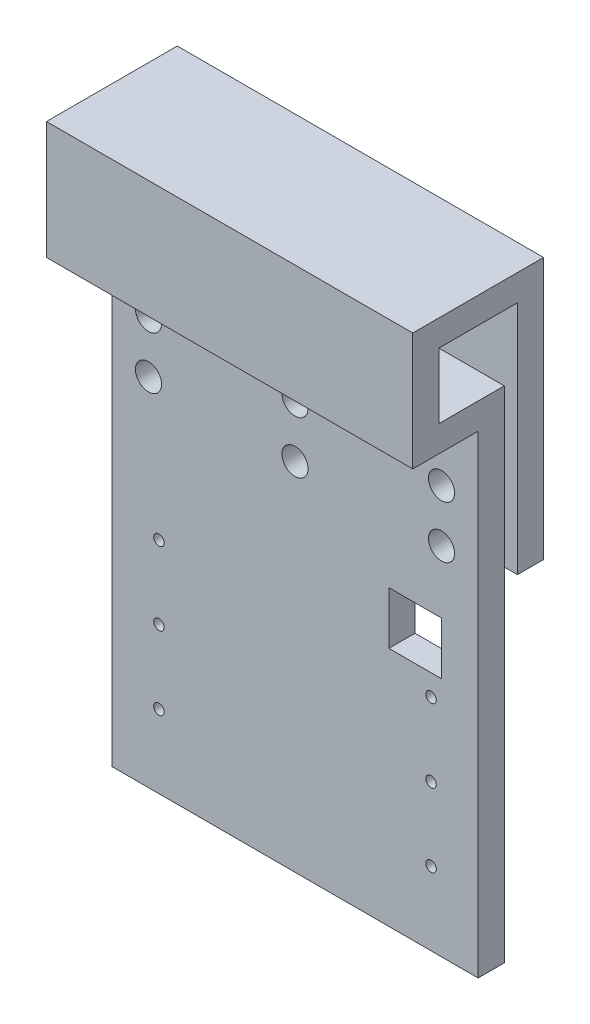
ISO-10303-21;
HEADER;
FILE_DESCRIPTION(('STEP AP214'),'2;1');
FILE_NAME('part.step','',(''),(''),'','','');
FILE_SCHEMA(('AUTOMOTIVE_DESIGN { 1 0 10303 214 1 1 1 1 }'));
ENDSEC;
DATA;
#1=APPLICATION_CONTEXT('core data for automotive mechanical design processes');
#2=APPLICATION_PROTOCOL_DEFINITION('international standard','automotive_design',2000,#1);
#3=PRODUCT_CONTEXT('',#1,'mechanical');
#4=PRODUCT('Part','Part','',(#3));
#5=PRODUCT_RELATED_PRODUCT_CATEGORY('part','',(#4));
#6=PRODUCT_DEFINITION_FORMATION('','',#4);
#7=PRODUCT_DEFINITION_CONTEXT('part definition',#1,'design');
#8=PRODUCT_DEFINITION('design','',#6,#7);
#9=PRODUCT_DEFINITION_SHAPE('','',#8);
#10=(LENGTH_UNIT() NAMED_UNIT(*) SI_UNIT(.MILLI.,.METRE.));
#11=(NAMED_UNIT(*) PLANE_ANGLE_UNIT() SI_UNIT($,.RADIAN.));
#12=(NAMED_UNIT(*) SI_UNIT($,.STERADIAN.) SOLID_ANGLE_UNIT());
#13=UNCERTAINTY_MEASURE_WITH_UNIT(LENGTH_MEASURE(1.E-05),#10,'distance_accuracy_value','');
#14=(GEOMETRIC_REPRESENTATION_CONTEXT(3) GLOBAL_UNCERTAINTY_ASSIGNED_CONTEXT((#13)) GLOBAL_UNIT_ASSIGNED_CONTEXT((#10,
#11,#12)) REPRESENTATION_CONTEXT('',''));
#15=CARTESIAN_POINT('',(0.,0.,0.));
#16=DIRECTION('',(0.,0.,1.));
#17=DIRECTION('',(1.,0.,0.));
#18=AXIS2_PLACEMENT_3D('',#15,#16,#17);
#19=CARTESIAN_POINT('',(88.9,0.,-6.35000000000001));
#20=DIRECTION('',(0.,0.,-1.));
#21=DIRECTION('',(0.,1.,0.));
#22=AXIS2_PLACEMENT_3D('',#19,#20,#21);
#23=PLANE('',#22);
#24=CARTESIAN_POINT('',(11.43,-36.195,-6.35000000000001));
#25=DIRECTION('',(0.,0.,-1.));
#26=DIRECTION('',(0.,1.,0.));
#27=AXIS2_PLACEMENT_3D('',#24,#25,#26);
#28=CIRCLE('',#27,1.26999999999999);
#29=CARTESIAN_POINT('',(11.43,-34.925,-6.35000000000001));
#30=VERTEX_POINT('',#29);
#31=EDGE_CURVE('E232',#30,#30,#28,.F.);
#32=ORIENTED_EDGE('',*,*,#31,.T.);
#33=EDGE_LOOP('',(#32));
#34=FACE_BOUND('',#33,.T.);
#35=DIRECTION('',(0.,-1.,0.));
#36=VECTOR('',#35,1.);
#37=CARTESIAN_POINT('',(0.,0.,-6.35000000000001));
#38=LINE('',#37,#36);
#39=CARTESIAN_POINT('',(0.,49.53,-6.35));
#40=VERTEX_POINT('',#39);
#41=CARTESIAN_POINT('',(0.,-71.755,-6.35000000000002));
#42=VERTEX_POINT('',#41);
#43=EDGE_CURVE('E250',#40,#42,#38,.T.);
#44=ORIENTED_EDGE('',*,*,#43,.F.);
#45=DIRECTION('',(-1.,0.,0.));
#46=VECTOR('',#45,1.);
#47=CARTESIAN_POINT('',(88.9,49.53,-6.35));
#48=LINE('',#47,#46);
#49=CARTESIAN_POINT('',(88.9,49.53,-6.35));
#50=VERTEX_POINT('',#49);
#51=EDGE_CURVE('E157',#50,#40,#48,.T.);
#52=ORIENTED_EDGE('',*,*,#51,.F.);
#53=DIRECTION('',(0.,-1.,0.));
#54=VECTOR('',#53,1.);
#55=CARTESIAN_POINT('',(88.9,0.,-6.35000000000001));
#56=LINE('',#55,#54);
#57=CARTESIAN_POINT('',(88.9,-71.755,-6.35000000000002));
#58=VERTEX_POINT('',#57);
#59=EDGE_CURVE('E251',#50,#58,#56,.T.);
#60=ORIENTED_EDGE('',*,*,#59,.T.);
#61=DIRECTION('',(-1.,0.,0.));
#62=VECTOR('',#61,1.);
#63=CARTESIAN_POINT('',(88.9,-71.755,-6.35000000000002));
#64=LINE('',#63,#62);
#65=EDGE_CURVE('E293',#58,#42,#64,.T.);
#66=ORIENTED_EDGE('',*,*,#65,.T.);
#67=EDGE_LOOP('',(#44,#52,#60,#66));
#68=FACE_BOUND('',#67,.T.);
#69=CARTESIAN_POINT('',(80.01,27.305,-6.35000000000001));
#70=DIRECTION('',(0.,0.,-1.));
#71=DIRECTION('',(0.,1.,0.));
#72=AXIS2_PLACEMENT_3D('',#69,#70,#71);
#73=CIRCLE('',#72,3.175);
#74=CARTESIAN_POINT('',(80.01,30.48,-6.35000000000001));
#75=VERTEX_POINT('',#74);
#76=EDGE_CURVE('E383',#75,#75,#73,.T.);
#77=ORIENTED_EDGE('',*,*,#76,.F.);
#78=EDGE_LOOP('',(#77));
#79=FACE_BOUND('',#78,.T.);
#80=DIRECTION('',(-1.,0.,0.));
#81=VECTOR('',#80,1.);
#82=CARTESIAN_POINT('',(88.9,-13.3029247066067,-6.35000000000001));
#83=LINE('',#82,#81);
#84=CARTESIAN_POINT('',(80.01,-13.3029247066067,-6.35000000000001));
#85=VERTEX_POINT('',#84);
#86=CARTESIAN_POINT('',(67.2257445853371,-13.3029247066067,-6.35000000000001));
#87=VERTEX_POINT('',#86);
#88=EDGE_CURVE('E164',#85,#87,#83,.T.);
#89=ORIENTED_EDGE('',*,*,#88,.F.);
#90=DIRECTION('',(0.,-1.,0.));
#91=VECTOR('',#90,1.);
#92=CARTESIAN_POINT('',(80.01,0.,-6.35000000000001));
#93=LINE('',#92,#91);
#94=CARTESIAN_POINT('',(80.01,-0.542664975393077,-6.35000000000001));
#95=VERTEX_POINT('',#94);
#96=EDGE_CURVE('E408',#95,#85,#93,.T.);
#97=ORIENTED_EDGE('',*,*,#96,.F.);
#98=DIRECTION('',(-1.,0.,0.));
#99=VECTOR('',#98,1.);
#100=CARTESIAN_POINT('',(88.9,-0.542664975393077,-6.35000000000001));
#101=LINE('',#100,#99);
#102=CARTESIAN_POINT('',(67.2257445853371,-0.542664975393077,-6.35000000000001));
#103=VERTEX_POINT('',#102);
#104=EDGE_CURVE('E404',#95,#103,#101,.T.);
#105=ORIENTED_EDGE('',*,*,#104,.T.);
#106=DIRECTION('',(0.,-1.,0.));
#107=VECTOR('',#106,1.);
#108=CARTESIAN_POINT('',(67.2257445853371,0.,-6.35000000000001));
#109=LINE('',#108,#107);
#110=EDGE_CURVE('E401',#103,#87,#109,.T.);
#111=ORIENTED_EDGE('',*,*,#110,.T.);
#112=EDGE_LOOP('',(#89,#97,#105,#111));
#113=FACE_BOUND('',#112,.T.);
#114=CARTESIAN_POINT('',(77.47,-18.415,-6.35000000000001));
#115=DIRECTION('',(0.,0.,-1.));
#116=DIRECTION('',(0.,1.,0.));
#117=AXIS2_PLACEMENT_3D('',#114,#115,#116);
#118=CIRCLE('',#117,1.26999999999999);
#119=CARTESIAN_POINT('',(77.47,-17.145,-6.35000000000001));
#120=VERTEX_POINT('',#119);
#121=EDGE_CURVE('E184',#120,#120,#118,.T.);
#122=ORIENTED_EDGE('',*,*,#121,.F.);
#123=EDGE_LOOP('',(#122));
#124=FACE_BOUND('',#123,.T.);
#125=CARTESIAN_POINT('',(77.47,-36.195,-6.35000000000001));
#126=DIRECTION('',(0.,0.,-1.));
#127=DIRECTION('',(0.,1.,0.));
#128=AXIS2_PLACEMENT_3D('',#125,#126,#127);
#129=CIRCLE('',#128,1.26999999999999);
#130=CARTESIAN_POINT('',(77.47,-34.925,-6.35000000000001));
#131=VERTEX_POINT('',#130);
#132=EDGE_CURVE('E189',#131,#131,#129,.T.);
#133=ORIENTED_EDGE('',*,*,#132,.F.);
#134=EDGE_LOOP('',(#133));
#135=FACE_BOUND('',#134,.T.);
#136=CARTESIAN_POINT('',(77.47,-53.975,-6.35000000000001));
#137=DIRECTION('',(0.,0.,-1.));
#138=DIRECTION('',(0.,1.,0.));
#139=AXIS2_PLACEMENT_3D('',#136,#137,#138);
#140=CIRCLE('',#139,1.26999999999999);
#141=CARTESIAN_POINT('',(77.47,-52.705,-6.35000000000001));
#142=VERTEX_POINT('',#141);
#143=EDGE_CURVE('E194',#142,#142,#140,.T.);
#144=ORIENTED_EDGE('',*,*,#143,.F.);
#145=EDGE_LOOP('',(#144));
#146=FACE_BOUND('',#145,.T.);
#147=CARTESIAN_POINT('',(44.45,27.305,-6.35000000000001));
#148=DIRECTION('',(0.,0.,-1.));
#149=DIRECTION('',(0.,1.,0.));
#150=AXIS2_PLACEMENT_3D('',#147,#148,#149);
#151=CIRCLE('',#150,3.175);
#152=CARTESIAN_POINT('',(44.45,30.48,-6.35000000000001));
#153=VERTEX_POINT('',#152);
#154=EDGE_CURVE('E205',#153,#153,#151,.T.);
#155=ORIENTED_EDGE('',*,*,#154,.F.);
#156=EDGE_LOOP('',(#155));
#157=FACE_BOUND('',#156,.T.);
#158=CARTESIAN_POINT('',(8.89,27.305,-6.35000000000001));
#159=DIRECTION('',(0.,0.,-1.));
#160=DIRECTION('',(0.,1.,0.));
#161=AXIS2_PLACEMENT_3D('',#158,#159,#160);
#162=CIRCLE('',#161,3.175);
#163=CARTESIAN_POINT('',(8.89,30.48,-6.35000000000001));
#164=VERTEX_POINT('',#163);
#165=EDGE_CURVE('E211',#164,#164,#162,.T.);
#166=ORIENTED_EDGE('',*,*,#165,.F.);
#167=EDGE_LOOP('',(#166));
#168=FACE_BOUND('',#167,.T.);
#169=CARTESIAN_POINT('',(8.89,14.605,-6.35000000000001));
#170=DIRECTION('',(0.,0.,-1.));
#171=DIRECTION('',(0.,1.,0.));
#172=AXIS2_PLACEMENT_3D('',#169,#170,#171);
#173=CIRCLE('',#172,3.175);
#174=CARTESIAN_POINT('',(8.89,17.78,-6.35000000000001));
#175=VERTEX_POINT('',#174);
#176=EDGE_CURVE('E217',#175,#175,#173,.T.);
#177=ORIENTED_EDGE('',*,*,#176,.F.);
#178=EDGE_LOOP('',(#177));
#179=FACE_BOUND('',#178,.T.);
#180=CARTESIAN_POINT('',(44.45,14.605,-6.35000000000001));
#181=DIRECTION('',(0.,0.,-1.));
#182=DIRECTION('',(0.,1.,0.));
#183=AXIS2_PLACEMENT_3D('',#180,#181,#182);
#184=CIRCLE('',#183,3.175);
#185=CARTESIAN_POINT('',(44.45,17.78,-6.35000000000001));
#186=VERTEX_POINT('',#185);
#187=EDGE_CURVE('E223',#186,#186,#184,.T.);
#188=ORIENTED_EDGE('',*,*,#187,.F.);
#189=EDGE_LOOP('',(#188));
#190=FACE_BOUND('',#189,.T.);
#191=CARTESIAN_POINT('',(80.01,14.605,-6.35000000000001));
#192=DIRECTION('',(0.,0.,-1.));
#193=DIRECTION('',(0.,1.,0.));
#194=AXIS2_PLACEMENT_3D('',#191,#192,#193);
#195=CIRCLE('',#194,3.175);
#196=CARTESIAN_POINT('',(80.01,17.78,-6.35000000000001));
#197=VERTEX_POINT('',#196);
#198=EDGE_CURVE('E228',#197,#197,#195,.T.);
#199=ORIENTED_EDGE('',*,*,#198,.F.);
#200=EDGE_LOOP('',(#199));
#201=FACE_BOUND('',#200,.T.);
#202=CARTESIAN_POINT('',(11.43,-18.415,-6.35000000000001));
#203=DIRECTION('',(0.,0.,-1.));
#204=DIRECTION('',(0.,1.,0.));
#205=AXIS2_PLACEMENT_3D('',#202,#203,#204);
#206=CIRCLE('',#205,1.26999999999999);
#207=CARTESIAN_POINT('',(11.43,-17.145,-6.35000000000001));
#208=VERTEX_POINT('',#207);
#209=EDGE_CURVE('E227',#208,#208,#206,.F.);
#210=ORIENTED_EDGE('',*,*,#209,.T.);
#211=EDGE_LOOP('',(#210));
#212=FACE_BOUND('',#211,.T.);
#213=CARTESIAN_POINT('',(11.43,-53.975,-6.35000000000001));
#214=DIRECTION('',(0.,0.,-1.));
#215=DIRECTION('',(0.,1.,0.));
#216=AXIS2_PLACEMENT_3D('',#213,#214,#215);
#217=CIRCLE('',#216,1.26999999999999);
#218=CARTESIAN_POINT('',(11.43,-52.705,-6.35000000000001));
#219=VERTEX_POINT('',#218);
#220=EDGE_CURVE('E246',#219,#219,#217,.F.);
#221=ORIENTED_EDGE('',*,*,#220,.T.);
#222=EDGE_LOOP('',(#221));
#223=FACE_BOUND('',#222,.T.);
#224=ADVANCED_FACE('F39',(#34,#68,#79,#113,#124,#135,#146,#157,#168,#179,#190,#201,#212,#223),
#23,.T.);
#225=CARTESIAN_POINT('',(88.9,0.,0.));
#226=DIRECTION('',(0.,0.,-1.));
#227=DIRECTION('',(0.,1.,0.));
#228=AXIS2_PLACEMENT_3D('',#225,#226,#227);
#229=PLANE('',#228);
#230=CARTESIAN_POINT('',(80.01,14.605,0.));
#231=DIRECTION('',(0.,0.,-1.));
#232=DIRECTION('',(0.,1.,0.));
#233=AXIS2_PLACEMENT_3D('',#230,#231,#232);
#234=CIRCLE('',#233,3.175);
#235=CARTESIAN_POINT('',(80.01,17.78,0.));
#236=VERTEX_POINT('',#235);
#237=EDGE_CURVE('E218',#236,#236,#234,.T.);
#238=ORIENTED_EDGE('',*,*,#237,.T.);
#239=EDGE_LOOP('',(#238));
#240=FACE_BOUND('',#239,.T.);
#241=CARTESIAN_POINT('',(44.45,14.605,0.));
#242=DIRECTION('',(0.,0.,-1.));
#243=DIRECTION('',(0.,1.,0.));
#244=AXIS2_PLACEMENT_3D('',#241,#242,#243);
#245=CIRCLE('',#244,3.175);
#246=CARTESIAN_POINT('',(44.45,17.78,0.));
#247=VERTEX_POINT('',#246);
#248=EDGE_CURVE('E212',#247,#247,#245,.T.);
#249=ORIENTED_EDGE('',*,*,#248,.T.);
#250=EDGE_LOOP('',(#249));
#251=FACE_BOUND('',#250,.T.);
#252=CARTESIAN_POINT('',(8.89,14.605,0.));
#253=DIRECTION('',(0.,0.,-1.));
#254=DIRECTION('',(0.,1.,0.));
#255=AXIS2_PLACEMENT_3D('',#252,#253,#254);
#256=CIRCLE('',#255,3.175);
#257=CARTESIAN_POINT('',(8.89,17.78,0.));
#258=VERTEX_POINT('',#257);
#259=EDGE_CURVE('E206',#258,#258,#256,.T.);
#260=ORIENTED_EDGE('',*,*,#259,.T.);
#261=EDGE_LOOP('',(#260));
#262=FACE_BOUND('',#261,.T.);
#263=CARTESIAN_POINT('',(8.89,27.305,0.));
#264=DIRECTION('',(0.,0.,-1.));
#265=DIRECTION('',(0.,1.,0.));
#266=AXIS2_PLACEMENT_3D('',#263,#264,#265);
#267=CIRCLE('',#266,3.175);
#268=CARTESIAN_POINT('',(8.89,30.48,0.));
#269=VERTEX_POINT('',#268);
#270=EDGE_CURVE('E200',#269,#269,#267,.T.);
#271=ORIENTED_EDGE('',*,*,#270,.T.);
#272=EDGE_LOOP('',(#271));
#273=FACE_BOUND('',#272,.T.);
#274=CARTESIAN_POINT('',(44.45,27.305,0.));
#275=DIRECTION('',(0.,0.,-1.));
#276=DIRECTION('',(0.,1.,0.));
#277=AXIS2_PLACEMENT_3D('',#274,#275,#276);
#278=CIRCLE('',#277,3.175);
#279=CARTESIAN_POINT('',(44.45,30.48,0.));
#280=VERTEX_POINT('',#279);
#281=EDGE_CURVE('E195',#280,#280,#278,.T.);
#282=ORIENTED_EDGE('',*,*,#281,.T.);
#283=EDGE_LOOP('',(#282));
#284=FACE_BOUND('',#283,.T.);
#285=CARTESIAN_POINT('',(77.47,-53.975,0.));
#286=DIRECTION('',(0.,0.,-1.));
#287=DIRECTION('',(0.,1.,0.));
#288=AXIS2_PLACEMENT_3D('',#285,#286,#287);
#289=CIRCLE('',#288,1.26999999999999);
#290=CARTESIAN_POINT('',(77.47,-52.705,0.));
#291=VERTEX_POINT('',#290);
#292=EDGE_CURVE('E190',#291,#291,#289,.T.);
#293=ORIENTED_EDGE('',*,*,#292,.T.);
#294=EDGE_LOOP('',(#293));
#295=FACE_BOUND('',#294,.T.);
#296=CARTESIAN_POINT('',(77.47,-36.195,0.));
#297=DIRECTION('',(0.,0.,-1.));
#298=DIRECTION('',(0.,1.,0.));
#299=AXIS2_PLACEMENT_3D('',#296,#297,#298);
#300=CIRCLE('',#299,1.26999999999999);
#301=CARTESIAN_POINT('',(77.47,-34.925,0.));
#302=VERTEX_POINT('',#301);
#303=EDGE_CURVE('E185',#302,#302,#300,.T.);
#304=ORIENTED_EDGE('',*,*,#303,.T.);
#305=EDGE_LOOP('',(#304));
#306=FACE_BOUND('',#305,.T.);
#307=CARTESIAN_POINT('',(77.47,-18.415,0.));
#308=DIRECTION('',(0.,0.,-1.));
#309=DIRECTION('',(0.,1.,0.));
#310=AXIS2_PLACEMENT_3D('',#307,#308,#309);
#311=CIRCLE('',#310,1.26999999999999);
#312=CARTESIAN_POINT('',(77.47,-17.145,0.));
#313=VERTEX_POINT('',#312);
#314=EDGE_CURVE('E180',#313,#313,#311,.T.);
#315=ORIENTED_EDGE('',*,*,#314,.T.);
#316=EDGE_LOOP('',(#315));
#317=FACE_BOUND('',#316,.T.);
#318=DIRECTION('',(0.,-1.,0.));
#319=VECTOR('',#318,1.);
#320=CARTESIAN_POINT('',(80.01,0.,0.));
#321=LINE('',#320,#319);
#322=CARTESIAN_POINT('',(80.01,-0.542664975393077,0.));
#323=VERTEX_POINT('',#322);
#324=CARTESIAN_POINT('',(80.01,-13.3029247066067,0.));
#325=VERTEX_POINT('',#324);
#326=EDGE_CURVE('E48',#323,#325,#321,.T.);
#327=ORIENTED_EDGE('',*,*,#326,.T.);
#328=DIRECTION('',(-1.,0.,0.));
#329=VECTOR('',#328,1.);
#330=CARTESIAN_POINT('',(88.9,-13.3029247066067,0.));
#331=LINE('',#330,#329);
#332=CARTESIAN_POINT('',(67.2257445853371,-13.3029247066067,0.));
#333=VERTEX_POINT('',#332);
#334=EDGE_CURVE('E11',#325,#333,#331,.T.);
#335=ORIENTED_EDGE('',*,*,#334,.T.);
#336=DIRECTION('',(0.,-1.,0.));
#337=VECTOR('',#336,1.);
#338=CARTESIAN_POINT('',(67.2257445853371,0.,0.));
#339=LINE('',#338,#337);
#340=CARTESIAN_POINT('',(67.2257445853371,-0.542664975393077,0.));
#341=VERTEX_POINT('',#340);
#342=EDGE_CURVE('E151',#341,#333,#339,.T.);
#343=ORIENTED_EDGE('',*,*,#342,.F.);
#344=DIRECTION('',(-1.,0.,0.));
#345=VECTOR('',#344,1.);
#346=CARTESIAN_POINT('',(88.9,-0.542664975393077,0.));
#347=LINE('',#346,#345);
#348=EDGE_CURVE('E156',#323,#341,#347,.T.);
#349=ORIENTED_EDGE('',*,*,#348,.F.);
#350=EDGE_LOOP('',(#327,#335,#343,#349));
#351=FACE_BOUND('',#350,.T.);
#352=CARTESIAN_POINT('',(80.01,27.305,0.));
#353=DIRECTION('',(0.,0.,-1.));
#354=DIRECTION('',(0.,1.,0.));
#355=AXIS2_PLACEMENT_3D('',#352,#353,#354);
#356=CIRCLE('',#355,3.175);
#357=CARTESIAN_POINT('',(80.01,30.48,0.));
#358=VERTEX_POINT('',#357);
#359=EDGE_CURVE('E374',#358,#358,#356,.T.);
#360=ORIENTED_EDGE('',*,*,#359,.T.);
#361=EDGE_LOOP('',(#360));
#362=FACE_BOUND('',#361,.T.);
#363=DIRECTION('',(0.,-1.,0.));
#364=VECTOR('',#363,1.);
#365=CARTESIAN_POINT('',(0.,0.,0.));
#366=LINE('',#365,#364);
#367=CARTESIAN_POINT('',(0.,43.18,0.));
#368=VERTEX_POINT('',#367);
#369=CARTESIAN_POINT('',(0.,-71.755,0.));
#370=VERTEX_POINT('',#369);
#371=EDGE_CURVE('E328',#368,#370,#366,.T.);
#372=ORIENTED_EDGE('',*,*,#371,.T.);
#373=DIRECTION('',(-1.,0.,0.));
#374=VECTOR('',#373,1.);
#375=CARTESIAN_POINT('',(88.9,-71.755,0.));
#376=LINE('',#375,#374);
#377=CARTESIAN_POINT('',(88.9,-71.755,0.));
#378=VERTEX_POINT('',#377);
#379=EDGE_CURVE('E336',#378,#370,#376,.T.);
#380=ORIENTED_EDGE('',*,*,#379,.F.);
#381=DIRECTION('',(0.,-1.,0.));
#382=VECTOR('',#381,1.);
#383=CARTESIAN_POINT('',(88.9,0.,0.));
#384=LINE('',#383,#382);
#385=CARTESIAN_POINT('',(88.9,43.18,0.));
#386=VERTEX_POINT('',#385);
#387=EDGE_CURVE('E287',#386,#378,#384,.T.);
#388=ORIENTED_EDGE('',*,*,#387,.F.);
#389=DIRECTION('',(-1.,0.,0.));
#390=VECTOR('',#389,1.);
#391=CARTESIAN_POINT('',(88.9,43.18,0.));
#392=LINE('',#391,#390);
#393=EDGE_CURVE('E340',#386,#368,#392,.T.);
#394=ORIENTED_EDGE('',*,*,#393,.T.);
#395=EDGE_LOOP('',(#372,#380,#388,#394));
#396=FACE_BOUND('',#395,.T.);
#397=CARTESIAN_POINT('',(11.43,-18.415,0.));
#398=DIRECTION('',(0.,0.,-1.));
#399=DIRECTION('',(0.,1.,0.));
#400=AXIS2_PLACEMENT_3D('',#397,#398,#399);
#401=CIRCLE('',#400,1.26999999999999);
#402=CARTESIAN_POINT('',(11.43,-17.145,0.));
#403=VERTEX_POINT('',#402);
#404=EDGE_CURVE('E224',#403,#403,#401,.F.);
#405=ORIENTED_EDGE('',*,*,#404,.F.);
#406=EDGE_LOOP('',(#405));
#407=FACE_BOUND('',#406,.T.);
#408=CARTESIAN_POINT('',(11.43,-36.195,0.));
#409=DIRECTION('',(0.,0.,-1.));
#410=DIRECTION('',(0.,1.,0.));
#411=AXIS2_PLACEMENT_3D('',#408,#409,#410);
#412=CIRCLE('',#411,1.26999999999999);
#413=CARTESIAN_POINT('',(11.43,-34.925,0.));
#414=VERTEX_POINT('',#413);
#415=EDGE_CURVE('E229',#414,#414,#412,.F.);
#416=ORIENTED_EDGE('',*,*,#415,.F.);
#417=EDGE_LOOP('',(#416));
#418=FACE_BOUND('',#417,.T.);
#419=CARTESIAN_POINT('',(11.43,-53.975,0.));
#420=DIRECTION('',(0.,0.,-1.));
#421=DIRECTION('',(0.,1.,0.));
#422=AXIS2_PLACEMENT_3D('',#419,#420,#421);
#423=CIRCLE('',#422,1.26999999999999);
#424=CARTESIAN_POINT('',(11.43,-52.705,0.));
#425=VERTEX_POINT('',#424);
#426=EDGE_CURVE('E42',#425,#425,#423,.F.);
#427=ORIENTED_EDGE('',*,*,#426,.F.);
#428=EDGE_LOOP('',(#427));
#429=FACE_BOUND('',#428,.T.);
#430=ADVANCED_FACE('F170',(#240,#251,#262,#273,#284,#295,#306,#317,#351,#362,#396,#407,#418,
#429),#229,.F.);
#431=CARTESIAN_POINT('',(88.9,49.53,0.));
#432=DIRECTION('',(0.,1.,0.));
#433=DIRECTION('',(0.,0.,1.));
#434=AXIS2_PLACEMENT_3D('',#431,#432,#433);
#435=PLANE('',#434);
#436=DIRECTION('',(0.,0.,-1.));
#437=VECTOR('',#436,1.);
#438=CARTESIAN_POINT('',(0.,49.53,0.));
#439=LINE('',#438,#437);
#440=CARTESIAN_POINT('',(0.,49.53,9.525));
#441=VERTEX_POINT('',#440);
#442=EDGE_CURVE('E297',#441,#40,#439,.T.);
#443=ORIENTED_EDGE('',*,*,#442,.F.);
#444=DIRECTION('',(-1.,0.,0.));
#445=VECTOR('',#444,1.);
#446=CARTESIAN_POINT('',(88.9,49.53,9.525));
#447=LINE('',#446,#445);
#448=CARTESIAN_POINT('',(88.9,49.53,9.525));
#449=VERTEX_POINT('',#448);
#450=EDGE_CURVE('E369',#449,#441,#447,.T.);
#451=ORIENTED_EDGE('',*,*,#450,.F.);
#452=DIRECTION('',(0.,0.,-1.));
#453=VECTOR('',#452,1.);
#454=CARTESIAN_POINT('',(88.9,49.53,0.));
#455=LINE('',#454,#453);
#456=EDGE_CURVE('E255',#449,#50,#455,.T.);
#457=ORIENTED_EDGE('',*,*,#456,.T.);
#458=ORIENTED_EDGE('',*,*,#51,.T.);
#459=EDGE_LOOP('',(#443,#451,#457,#458));
#460=FACE_BOUND('',#459,.T.);
#461=ADVANCED_FACE('F472',(#460),#435,.T.);
#462=CARTESIAN_POINT('',(88.9,0.,9.525));
#463=DIRECTION('',(0.,0.,-1.));
#464=DIRECTION('',(0.,1.,0.));
#465=AXIS2_PLACEMENT_3D('',#462,#463,#464);
#466=PLANE('',#465);
#467=DIRECTION('',(0.,-1.,0.));
#468=VECTOR('',#467,1.);
#469=CARTESIAN_POINT('',(0.,0.,9.525));
#470=LINE('',#469,#468);
#471=CARTESIAN_POINT('',(0.,65.405,9.525));
#472=VERTEX_POINT('',#471);
#473=EDGE_CURVE('E301',#472,#441,#470,.T.);
#474=ORIENTED_EDGE('',*,*,#473,.F.);
#475=DIRECTION('',(-1.,0.,0.));
#476=VECTOR('',#475,1.);
#477=CARTESIAN_POINT('',(88.9,65.405,9.525));
#478=LINE('',#477,#476);
#479=CARTESIAN_POINT('',(88.9,65.405,9.525));
#480=VERTEX_POINT('',#479);
#481=EDGE_CURVE('E366',#480,#472,#478,.T.);
#482=ORIENTED_EDGE('',*,*,#481,.F.);
#483=DIRECTION('',(0.,-1.,0.));
#484=VECTOR('',#483,1.);
#485=CARTESIAN_POINT('',(88.9,0.,9.525));
#486=LINE('',#485,#484);
#487=EDGE_CURVE('E260',#480,#449,#486,.T.);
#488=ORIENTED_EDGE('',*,*,#487,.T.);
#489=ORIENTED_EDGE('',*,*,#450,.T.);
#490=EDGE_LOOP('',(#474,#482,#488,#489));
#491=FACE_BOUND('',#490,.T.);
#492=ADVANCED_FACE('F478',(#491),#466,.T.);
#493=CARTESIAN_POINT('',(88.9,65.405,0.));
#494=DIRECTION('',(0.,-1.,0.));
#495=DIRECTION('',(0.,0.,-1.));
#496=AXIS2_PLACEMENT_3D('',#493,#494,#495);
#497=PLANE('',#496);
#498=DIRECTION('',(0.,0.,1.));
#499=VECTOR('',#498,1.);
#500=CARTESIAN_POINT('',(0.,65.405,0.));
#501=LINE('',#500,#499);
#502=CARTESIAN_POINT('',(0.,65.405,-9.525));
#503=VERTEX_POINT('',#502);
#504=EDGE_CURVE('E305',#503,#472,#501,.T.);
#505=ORIENTED_EDGE('',*,*,#504,.F.);
#506=DIRECTION('',(-1.,0.,0.));
#507=VECTOR('',#506,1.);
#508=CARTESIAN_POINT('',(88.9,65.405,-9.525));
#509=LINE('',#508,#507);
#510=CARTESIAN_POINT('',(88.9,65.405,-9.525));
#511=VERTEX_POINT('',#510);
#512=EDGE_CURVE('E363',#511,#503,#509,.T.);
#513=ORIENTED_EDGE('',*,*,#512,.F.);
#514=DIRECTION('',(0.,0.,1.));
#515=VECTOR('',#514,1.);
#516=CARTESIAN_POINT('',(88.9,65.405,0.));
#517=LINE('',#516,#515);
#518=EDGE_CURVE('E264',#511,#480,#517,.T.);
#519=ORIENTED_EDGE('',*,*,#518,.T.);
#520=ORIENTED_EDGE('',*,*,#481,.T.);
#521=EDGE_LOOP('',(#505,#513,#519,#520));
#522=FACE_BOUND('',#521,.T.);
#523=ADVANCED_FACE('F508',(#522),#497,.T.);
#524=CARTESIAN_POINT('',(88.9,0.,-9.525));
#525=DIRECTION('',(0.,0.,1.));
#526=DIRECTION('',(1.,0.,0.));
#527=AXIS2_PLACEMENT_3D('',#524,#525,#526);
#528=PLANE('',#527);
#529=CARTESIAN_POINT('',(80.01,14.605,-9.52500000000001));
#530=DIRECTION('',(0.,0.,1.));
#531=DIRECTION('',(1.,0.,0.));
#532=AXIS2_PLACEMENT_3D('',#529,#530,#531);
#533=CIRCLE('',#532,3.175);
#534=CARTESIAN_POINT('',(83.185,14.605,-9.52500000000001));
#535=VERTEX_POINT('',#534);
#536=EDGE_CURVE('E222',#535,#535,#533,.T.);
#537=ORIENTED_EDGE('',*,*,#536,.F.);
#538=EDGE_LOOP('',(#537));
#539=FACE_BOUND('',#538,.T.);
#540=CARTESIAN_POINT('',(44.45,14.605,-9.52500000000001));
#541=DIRECTION('',(0.,0.,1.));
#542=DIRECTION('',(1.,0.,0.));
#543=AXIS2_PLACEMENT_3D('',#540,#541,#542);
#544=CIRCLE('',#543,3.175);
#545=CARTESIAN_POINT('',(47.625,14.605,-9.52500000000001));
#546=VERTEX_POINT('',#545);
#547=EDGE_CURVE('E216',#546,#546,#544,.T.);
#548=ORIENTED_EDGE('',*,*,#547,.F.);
#549=EDGE_LOOP('',(#548));
#550=FACE_BOUND('',#549,.T.);
#551=CARTESIAN_POINT('',(8.89,14.605,-9.52500000000001));
#552=DIRECTION('',(0.,0.,1.));
#553=DIRECTION('',(1.,0.,0.));
#554=AXIS2_PLACEMENT_3D('',#551,#552,#553);
#555=CIRCLE('',#554,3.175);
#556=CARTESIAN_POINT('',(12.065,14.605,-9.52500000000001));
#557=VERTEX_POINT('',#556);
#558=EDGE_CURVE('E210',#557,#557,#555,.T.);
#559=ORIENTED_EDGE('',*,*,#558,.F.);
#560=EDGE_LOOP('',(#559));
#561=FACE_BOUND('',#560,.T.);
#562=CARTESIAN_POINT('',(8.89,27.305,-9.52500000000001));
#563=DIRECTION('',(0.,0.,1.));
#564=DIRECTION('',(1.,0.,0.));
#565=AXIS2_PLACEMENT_3D('',#562,#563,#564);
#566=CIRCLE('',#565,3.175);
#567=CARTESIAN_POINT('',(12.065,27.305,-9.52500000000001));
#568=VERTEX_POINT('',#567);
#569=EDGE_CURVE('E204',#568,#568,#566,.T.);
#570=ORIENTED_EDGE('',*,*,#569,.F.);
#571=EDGE_LOOP('',(#570));
#572=FACE_BOUND('',#571,.T.);
#573=CARTESIAN_POINT('',(44.45,27.305,-9.52500000000001));
#574=DIRECTION('',(0.,0.,1.));
#575=DIRECTION('',(1.,0.,0.));
#576=AXIS2_PLACEMENT_3D('',#573,#574,#575);
#577=CIRCLE('',#576,3.175);
#578=CARTESIAN_POINT('',(47.625,27.305,-9.52500000000001));
#579=VERTEX_POINT('',#578);
#580=EDGE_CURVE('E199',#579,#579,#577,.T.);
#581=ORIENTED_EDGE('',*,*,#580,.F.);
#582=EDGE_LOOP('',(#581));
#583=FACE_BOUND('',#582,.T.);
#584=CARTESIAN_POINT('',(80.01,27.305,-9.52500000000001));
#585=DIRECTION('',(0.,0.,1.));
#586=DIRECTION('',(1.,0.,0.));
#587=AXIS2_PLACEMENT_3D('',#584,#585,#586);
#588=CIRCLE('',#587,3.175);
#589=CARTESIAN_POINT('',(83.185,27.305,-9.52500000000001));
#590=VERTEX_POINT('',#589);
#591=EDGE_CURVE('E377',#590,#590,#588,.T.);
#592=ORIENTED_EDGE('',*,*,#591,.F.);
#593=EDGE_LOOP('',(#592));
#594=FACE_BOUND('',#593,.T.);
#595=DIRECTION('',(0.,1.,0.));
#596=VECTOR('',#595,1.);
#597=CARTESIAN_POINT('',(0.,0.,-9.525));
#598=LINE('',#597,#596);
#599=CARTESIAN_POINT('',(0.,8.255,-9.525));
#600=VERTEX_POINT('',#599);
#601=EDGE_CURVE('E309',#600,#503,#598,.T.);
#602=ORIENTED_EDGE('',*,*,#601,.F.);
#603=DIRECTION('',(-1.,0.,0.));
#604=VECTOR('',#603,1.);
#605=CARTESIAN_POINT('',(88.9,8.255,-9.525));
#606=LINE('',#605,#604);
#607=CARTESIAN_POINT('',(88.9,8.255,-9.525));
#608=VERTEX_POINT('',#607);
#609=EDGE_CURVE('E360',#608,#600,#606,.T.);
#610=ORIENTED_EDGE('',*,*,#609,.F.);
#611=DIRECTION('',(0.,1.,0.));
#612=VECTOR('',#611,1.);
#613=CARTESIAN_POINT('',(88.9,0.,-9.525));
#614=LINE('',#613,#612);
#615=EDGE_CURVE('E268',#608,#511,#614,.T.);
#616=ORIENTED_EDGE('',*,*,#615,.T.);
#617=ORIENTED_EDGE('',*,*,#512,.T.);
#618=EDGE_LOOP('',(#602,#610,#616,#617));
#619=FACE_BOUND('',#618,.T.);
#620=ADVANCED_FACE('F504',(#539,#550,#561,#572,#583,#594,#619),#528,.T.);
#621=CARTESIAN_POINT('',(88.9,8.255,0.));
#622=DIRECTION('',(0.,1.,0.));
#623=DIRECTION('',(0.,0.,1.));
#624=AXIS2_PLACEMENT_3D('',#621,#622,#623);
#625=PLANE('',#624);
#626=DIRECTION('',(0.,0.,-1.));
#627=VECTOR('',#626,1.);
#628=CARTESIAN_POINT('',(0.,8.255,0.));
#629=LINE('',#628,#627);
#630=CARTESIAN_POINT('',(0.,8.255,-15.875));
#631=VERTEX_POINT('',#630);
#632=EDGE_CURVE('E313',#600,#631,#629,.T.);
#633=ORIENTED_EDGE('',*,*,#632,.T.);
#634=DIRECTION('',(-1.,0.,0.));
#635=VECTOR('',#634,1.);
#636=CARTESIAN_POINT('',(88.9,8.255,-15.875));
#637=LINE('',#636,#635);
#638=CARTESIAN_POINT('',(88.9,8.255,-15.875));
#639=VERTEX_POINT('',#638);
#640=EDGE_CURVE('E356',#639,#631,#637,.T.);
#641=ORIENTED_EDGE('',*,*,#640,.F.);
#642=DIRECTION('',(0.,0.,-1.));
#643=VECTOR('',#642,1.);
#644=CARTESIAN_POINT('',(88.9,8.255,0.));
#645=LINE('',#644,#643);
#646=EDGE_CURVE('E272',#608,#639,#645,.T.);
#647=ORIENTED_EDGE('',*,*,#646,.F.);
#648=ORIENTED_EDGE('',*,*,#609,.T.);
#649=EDGE_LOOP('',(#633,#641,#647,#648));
#650=FACE_BOUND('',#649,.T.);
#651=ADVANCED_FACE('F500',(#650),#625,.F.);
#652=CARTESIAN_POINT('',(88.9,0.,-15.875));
#653=DIRECTION('',(0.,0.,1.));
#654=DIRECTION('',(1.,0.,0.));
#655=AXIS2_PLACEMENT_3D('',#652,#653,#654);
#656=PLANE('',#655);
#657=CARTESIAN_POINT('',(80.01,14.605,-15.875));
#658=DIRECTION('',(0.,0.,-1.));
#659=DIRECTION('',(-1.,0.,0.));
#660=AXIS2_PLACEMENT_3D('',#657,#658,#659);
#661=CIRCLE('',#660,3.175);
#662=CARTESIAN_POINT('',(76.835,14.605,-15.875));
#663=VERTEX_POINT('',#662);
#664=EDGE_CURVE('E167',#663,#663,#661,.T.);
#665=ORIENTED_EDGE('',*,*,#664,.F.);
#666=EDGE_LOOP('',(#665));
#667=FACE_BOUND('',#666,.T.);
#668=CARTESIAN_POINT('',(44.45,14.605,-15.875));
#669=DIRECTION('',(0.,0.,-1.));
#670=DIRECTION('',(-1.,0.,0.));
#671=AXIS2_PLACEMENT_3D('',#668,#669,#670);
#672=CIRCLE('',#671,3.175);
#673=CARTESIAN_POINT('',(41.275,14.605,-15.875));
#674=VERTEX_POINT('',#673);
#675=EDGE_CURVE('E395',#674,#674,#672,.T.);
#676=ORIENTED_EDGE('',*,*,#675,.F.);
#677=EDGE_LOOP('',(#676));
#678=FACE_BOUND('',#677,.T.);
#679=CARTESIAN_POINT('',(8.89,14.605,-15.875));
#680=DIRECTION('',(0.,0.,-1.));
#681=DIRECTION('',(-1.,0.,0.));
#682=AXIS2_PLACEMENT_3D('',#679,#680,#681);
#683=CIRCLE('',#682,3.175);
#684=CARTESIAN_POINT('',(5.71500000000001,14.605,-15.875));
#685=VERTEX_POINT('',#684);
#686=EDGE_CURVE('E802',#685,#685,#683,.T.);
#687=ORIENTED_EDGE('',*,*,#686,.F.);
#688=EDGE_LOOP('',(#687));
#689=FACE_BOUND('',#688,.T.);
#690=CARTESIAN_POINT('',(8.89,27.305,-15.875));
#691=DIRECTION('',(0.,0.,-1.));
#692=DIRECTION('',(-1.,0.,0.));
#693=AXIS2_PLACEMENT_3D('',#690,#691,#692);
#694=CIRCLE('',#693,3.175);
#695=CARTESIAN_POINT('',(5.715,27.305,-15.875));
#696=VERTEX_POINT('',#695);
#697=EDGE_CURVE('E392',#696,#696,#694,.T.);
#698=ORIENTED_EDGE('',*,*,#697,.F.);
#699=EDGE_LOOP('',(#698));
#700=FACE_BOUND('',#699,.T.);
#701=CARTESIAN_POINT('',(44.45,27.305,-15.875));
#702=DIRECTION('',(0.,0.,-1.));
#703=DIRECTION('',(-1.,0.,0.));
#704=AXIS2_PLACEMENT_3D('',#701,#702,#703);
#705=CIRCLE('',#704,3.175);
#706=CARTESIAN_POINT('',(41.275,27.305,-15.875));
#707=VERTEX_POINT('',#706);
#708=EDGE_CURVE('E386',#707,#707,#705,.T.);
#709=ORIENTED_EDGE('',*,*,#708,.F.);
#710=EDGE_LOOP('',(#709));
#711=FACE_BOUND('',#710,.T.);
#712=CARTESIAN_POINT('',(80.01,27.305,-15.875));
#713=DIRECTION('',(0.,0.,-1.));
#714=DIRECTION('',(-1.,0.,0.));
#715=AXIS2_PLACEMENT_3D('',#712,#713,#714);
#716=CIRCLE('',#715,3.175);
#717=CARTESIAN_POINT('',(76.835,27.305,-15.875));
#718=VERTEX_POINT('',#717);
#719=EDGE_CURVE('E378',#718,#718,#716,.T.);
#720=ORIENTED_EDGE('',*,*,#719,.F.);
#721=EDGE_LOOP('',(#720));
#722=FACE_BOUND('',#721,.T.);
#723=DIRECTION('',(0.,1.,0.));
#724=VECTOR('',#723,1.);
#725=CARTESIAN_POINT('',(0.,0.,-15.875));
#726=LINE('',#725,#724);
#727=CARTESIAN_POINT('',(0.,71.755,-15.875));
#728=VERTEX_POINT('',#727);
#729=EDGE_CURVE('E316',#631,#728,#726,.T.);
#730=ORIENTED_EDGE('',*,*,#729,.T.);
#731=DIRECTION('',(-1.,0.,0.));
#732=VECTOR('',#731,1.);
#733=CARTESIAN_POINT('',(88.9,71.755,-15.875));
#734=LINE('',#733,#732);
#735=CARTESIAN_POINT('',(88.9,71.755,-15.875));
#736=VERTEX_POINT('',#735);
#737=EDGE_CURVE('E352',#736,#728,#734,.T.);
#738=ORIENTED_EDGE('',*,*,#737,.F.);
#739=DIRECTION('',(0.,1.,0.));
#740=VECTOR('',#739,1.);
#741=CARTESIAN_POINT('',(88.9,0.,-15.875));
#742=LINE('',#741,#740);
#743=EDGE_CURVE('E275',#639,#736,#742,.T.);
#744=ORIENTED_EDGE('',*,*,#743,.F.);
#745=ORIENTED_EDGE('',*,*,#640,.T.);
#746=EDGE_LOOP('',(#730,#738,#744,#745));
#747=FACE_BOUND('',#746,.T.);
#748=ADVANCED_FACE('F496',(#667,#678,#689,#700,#711,#722,#747),#656,.F.);
#749=CARTESIAN_POINT('',(88.9,71.755,0.));
#750=DIRECTION('',(0.,-1.,0.));
#751=DIRECTION('',(0.,0.,-1.));
#752=AXIS2_PLACEMENT_3D('',#749,#750,#751);
#753=PLANE('',#752);
#754=DIRECTION('',(0.,0.,1.));
#755=VECTOR('',#754,1.);
#756=CARTESIAN_POINT('',(0.,71.755,0.));
#757=LINE('',#756,#755);
#758=CARTESIAN_POINT('',(0.,71.755,15.875));
#759=VERTEX_POINT('',#758);
#760=EDGE_CURVE('E319',#728,#759,#757,.T.);
#761=ORIENTED_EDGE('',*,*,#760,.T.);
#762=DIRECTION('',(-1.,0.,0.));
#763=VECTOR('',#762,1.);
#764=CARTESIAN_POINT('',(88.9,71.755,15.875));
#765=LINE('',#764,#763);
#766=CARTESIAN_POINT('',(88.9,71.755,15.875));
#767=VERTEX_POINT('',#766);
#768=EDGE_CURVE('E348',#767,#759,#765,.T.);
#769=ORIENTED_EDGE('',*,*,#768,.F.);
#770=DIRECTION('',(0.,0.,1.));
#771=VECTOR('',#770,1.);
#772=CARTESIAN_POINT('',(88.9,71.755,0.));
#773=LINE('',#772,#771);
#774=EDGE_CURVE('E278',#736,#767,#773,.T.);
#775=ORIENTED_EDGE('',*,*,#774,.F.);
#776=ORIENTED_EDGE('',*,*,#737,.T.);
#777=EDGE_LOOP('',(#761,#769,#775,#776));
#778=FACE_BOUND('',#777,.T.);
#779=ADVANCED_FACE('F492',(#778),#753,.F.);
#780=CARTESIAN_POINT('',(88.9,0.,15.875));
#781=DIRECTION('',(0.,0.,-1.));
#782=DIRECTION('',(0.,1.,0.));
#783=AXIS2_PLACEMENT_3D('',#780,#781,#782);
#784=PLANE('',#783);
#785=DIRECTION('',(0.,-1.,0.));
#786=VECTOR('',#785,1.);
#787=CARTESIAN_POINT('',(0.,0.,15.875));
#788=LINE('',#787,#786);
#789=CARTESIAN_POINT('',(0.,43.18,15.875));
#790=VERTEX_POINT('',#789);
#791=EDGE_CURVE('E322',#759,#790,#788,.T.);
#792=ORIENTED_EDGE('',*,*,#791,.T.);
#793=DIRECTION('',(-1.,0.,0.));
#794=VECTOR('',#793,1.);
#795=CARTESIAN_POINT('',(88.9,43.18,15.875));
#796=LINE('',#795,#794);
#797=CARTESIAN_POINT('',(88.9,43.18,15.875));
#798=VERTEX_POINT('',#797);
#799=EDGE_CURVE('E344',#798,#790,#796,.T.);
#800=ORIENTED_EDGE('',*,*,#799,.F.);
#801=DIRECTION('',(0.,-1.,0.));
#802=VECTOR('',#801,1.);
#803=CARTESIAN_POINT('',(88.9,0.,15.875));
#804=LINE('',#803,#802);
#805=EDGE_CURVE('E281',#767,#798,#804,.T.);
#806=ORIENTED_EDGE('',*,*,#805,.F.);
#807=ORIENTED_EDGE('',*,*,#768,.T.);
#808=EDGE_LOOP('',(#792,#800,#806,#807));
#809=FACE_BOUND('',#808,.T.);
#810=ADVANCED_FACE('F488',(#809),#784,.F.);
#811=CARTESIAN_POINT('',(88.9,43.18,0.));
#812=DIRECTION('',(0.,1.,0.));
#813=DIRECTION('',(0.,0.,1.));
#814=AXIS2_PLACEMENT_3D('',#811,#812,#813);
#815=PLANE('',#814);
#816=DIRECTION('',(0.,0.,-1.));
#817=VECTOR('',#816,1.);
#818=CARTESIAN_POINT('',(0.,43.18,0.));
#819=LINE('',#818,#817);
#820=EDGE_CURVE('E325',#790,#368,#819,.T.);
#821=ORIENTED_EDGE('',*,*,#820,.T.);
#822=ORIENTED_EDGE('',*,*,#393,.F.);
#823=DIRECTION('',(0.,0.,-1.));
#824=VECTOR('',#823,1.);
#825=CARTESIAN_POINT('',(88.9,43.18,0.));
#826=LINE('',#825,#824);
#827=EDGE_CURVE('E284',#798,#386,#826,.T.);
#828=ORIENTED_EDGE('',*,*,#827,.F.);
#829=ORIENTED_EDGE('',*,*,#799,.T.);
#830=EDGE_LOOP('',(#821,#822,#828,#829));
#831=FACE_BOUND('',#830,.T.);
#832=ADVANCED_FACE('F485',(#831),#815,.F.);
#833=CARTESIAN_POINT('',(88.9,-71.755,0.));
#834=DIRECTION('',(0.,1.,0.));
#835=DIRECTION('',(0.,0.,1.));
#836=AXIS2_PLACEMENT_3D('',#833,#834,#835);
#837=PLANE('',#836);
#838=DIRECTION('',(0.,0.,-1.));
#839=VECTOR('',#838,1.);
#840=CARTESIAN_POINT('',(0.,-71.755,0.));
#841=LINE('',#840,#839);
#842=EDGE_CURVE('E256',#370,#42,#841,.T.);
#843=ORIENTED_EDGE('',*,*,#842,.T.);
#844=ORIENTED_EDGE('',*,*,#65,.F.);
#845=DIRECTION('',(0.,0.,-1.));
#846=VECTOR('',#845,1.);
#847=CARTESIAN_POINT('',(88.9,-71.755,0.));
#848=LINE('',#847,#846);
#849=EDGE_CURVE('E290',#378,#58,#848,.T.);
#850=ORIENTED_EDGE('',*,*,#849,.F.);
#851=ORIENTED_EDGE('',*,*,#379,.T.);
#852=EDGE_LOOP('',(#843,#844,#850,#851));
#853=FACE_BOUND('',#852,.T.);
#854=ADVANCED_FACE('F483',(#853),#837,.F.);
#855=CARTESIAN_POINT('',(88.9,0.,0.));
#856=DIRECTION('',(1.,0.,0.));
#857=DIRECTION('',(0.,0.,-1.));
#858=AXIS2_PLACEMENT_3D('',#855,#856,#857);
#859=PLANE('',#858);
#860=ORIENTED_EDGE('',*,*,#59,.F.);
#861=ORIENTED_EDGE('',*,*,#456,.F.);
#862=ORIENTED_EDGE('',*,*,#487,.F.);
#863=ORIENTED_EDGE('',*,*,#518,.F.);
#864=ORIENTED_EDGE('',*,*,#615,.F.);
#865=ORIENTED_EDGE('',*,*,#646,.T.);
#866=ORIENTED_EDGE('',*,*,#743,.T.);
#867=ORIENTED_EDGE('',*,*,#774,.T.);
#868=ORIENTED_EDGE('',*,*,#805,.T.);
#869=ORIENTED_EDGE('',*,*,#827,.T.);
#870=ORIENTED_EDGE('',*,*,#387,.T.);
#871=ORIENTED_EDGE('',*,*,#849,.T.);
#872=EDGE_LOOP('',(#860,#861,#862,#863,#864,#865,#866,#867,#868,#869,#870,#871));
#873=FACE_BOUND('',#872,.T.);
#874=ADVANCED_FACE('F529',(#873),#859,.T.);
#875=CARTESIAN_POINT('',(0.,0.,0.));
#876=DIRECTION('',(1.,0.,0.));
#877=DIRECTION('',(0.,0.,-1.));
#878=AXIS2_PLACEMENT_3D('',#875,#876,#877);
#879=PLANE('',#878);
#880=ORIENTED_EDGE('',*,*,#43,.T.);
#881=ORIENTED_EDGE('',*,*,#842,.F.);
#882=ORIENTED_EDGE('',*,*,#371,.F.);
#883=ORIENTED_EDGE('',*,*,#820,.F.);
#884=ORIENTED_EDGE('',*,*,#791,.F.);
#885=ORIENTED_EDGE('',*,*,#760,.F.);
#886=ORIENTED_EDGE('',*,*,#729,.F.);
#887=ORIENTED_EDGE('',*,*,#632,.F.);
#888=ORIENTED_EDGE('',*,*,#601,.T.);
#889=ORIENTED_EDGE('',*,*,#504,.T.);
#890=ORIENTED_EDGE('',*,*,#473,.T.);
#891=ORIENTED_EDGE('',*,*,#442,.T.);
#892=EDGE_LOOP('',(#880,#881,#882,#883,#884,#885,#886,#887,#888,#889,#890,#891));
#893=FACE_BOUND('',#892,.T.);
#894=ADVANCED_FACE('F522',(#893),#879,.F.);
#895=CARTESIAN_POINT('',(80.01,27.305,65.405));
#896=DIRECTION('',(0.,0.,-1.));
#897=DIRECTION('',(-1.,0.,0.));
#898=AXIS2_PLACEMENT_3D('',#895,#896,#897);
#899=CYLINDRICAL_SURFACE('',#898,3.175);
#900=ORIENTED_EDGE('',*,*,#76,.T.);
#901=EDGE_LOOP('',(#900));
#902=FACE_BOUND('',#901,.T.);
#903=ORIENTED_EDGE('',*,*,#359,.F.);
#904=EDGE_LOOP('',(#903));
#905=FACE_BOUND('',#904,.T.);
#906=ADVANCED_FACE('F615',(#902,#905),#899,.F.);
#907=CARTESIAN_POINT('',(80.01,-13.3029247066067,65.405));
#908=DIRECTION('',(0.,-1.,0.));
#909=DIRECTION('',(0.,0.,-1.));
#910=AXIS2_PLACEMENT_3D('',#907,#908,#909);
#911=PLANE('',#910);
#912=ORIENTED_EDGE('',*,*,#88,.T.);
#913=DIRECTION('',(0.,0.,-1.));
#914=VECTOR('',#913,1.);
#915=CARTESIAN_POINT('',(67.2257445853371,-13.3029247066067,65.405));
#916=LINE('',#915,#914);
#917=EDGE_CURVE('E56',#333,#87,#916,.T.);
#918=ORIENTED_EDGE('',*,*,#917,.F.);
#919=ORIENTED_EDGE('',*,*,#334,.F.);
#920=DIRECTION('',(0.,0.,-1.));
#921=VECTOR('',#920,1.);
#922=CARTESIAN_POINT('',(80.01,-13.3029247066067,65.405));
#923=LINE('',#922,#921);
#924=EDGE_CURVE('E804',#325,#85,#923,.T.);
#925=ORIENTED_EDGE('',*,*,#924,.T.);
#926=EDGE_LOOP('',(#912,#918,#919,#925));
#927=FACE_BOUND('',#926,.T.);
#928=ADVANCED_FACE('F160',(#927),#911,.F.);
#929=CARTESIAN_POINT('',(80.01,-0.542664975393077,65.405));
#930=DIRECTION('',(1.,0.,0.));
#931=DIRECTION('',(0.,0.,-1.));
#932=AXIS2_PLACEMENT_3D('',#929,#930,#931);
#933=PLANE('',#932);
#934=ORIENTED_EDGE('',*,*,#96,.T.);
#935=ORIENTED_EDGE('',*,*,#924,.F.);
#936=ORIENTED_EDGE('',*,*,#326,.F.);
#937=DIRECTION('',(0.,0.,-1.));
#938=VECTOR('',#937,1.);
#939=CARTESIAN_POINT('',(80.01,-0.542664975393077,65.405));
#940=LINE('',#939,#938);
#941=EDGE_CURVE('E822',#323,#95,#940,.T.);
#942=ORIENTED_EDGE('',*,*,#941,.T.);
#943=EDGE_LOOP('',(#934,#935,#936,#942));
#944=FACE_BOUND('',#943,.T.);
#945=ADVANCED_FACE('F614',(#944),#933,.F.);
#946=CARTESIAN_POINT('',(80.01,-0.542664975393077,65.405));
#947=DIRECTION('',(0.,-1.,0.));
#948=DIRECTION('',(0.,0.,-1.));
#949=AXIS2_PLACEMENT_3D('',#946,#947,#948);
#950=PLANE('',#949);
#951=ORIENTED_EDGE('',*,*,#941,.F.);
#952=ORIENTED_EDGE('',*,*,#348,.T.);
#953=DIRECTION('',(0.,0.,-1.));
#954=VECTOR('',#953,1.);
#955=CARTESIAN_POINT('',(67.2257445853371,-0.542664975393077,65.405));
#956=LINE('',#955,#954);
#957=EDGE_CURVE('E61',#341,#103,#956,.T.);
#958=ORIENTED_EDGE('',*,*,#957,.T.);
#959=ORIENTED_EDGE('',*,*,#104,.F.);
#960=EDGE_LOOP('',(#951,#952,#958,#959));
#961=FACE_BOUND('',#960,.T.);
#962=ADVANCED_FACE('F609',(#961),#950,.T.);
#963=CARTESIAN_POINT('',(67.2257445853371,-0.542664975393077,65.405));
#964=DIRECTION('',(1.,0.,0.));
#965=DIRECTION('',(0.,0.,-1.));
#966=AXIS2_PLACEMENT_3D('',#963,#964,#965);
#967=PLANE('',#966);
#968=ORIENTED_EDGE('',*,*,#957,.F.);
#969=ORIENTED_EDGE('',*,*,#342,.T.);
#970=ORIENTED_EDGE('',*,*,#917,.T.);
#971=ORIENTED_EDGE('',*,*,#110,.F.);
#972=EDGE_LOOP('',(#968,#969,#970,#971));
#973=FACE_BOUND('',#972,.T.);
#974=ADVANCED_FACE('F152',(#973),#967,.T.);
#975=CARTESIAN_POINT('',(77.47,-18.415,65.405));
#976=DIRECTION('',(0.,0.,-1.));
#977=DIRECTION('',(-1.,0.,0.));
#978=AXIS2_PLACEMENT_3D('',#975,#976,#977);
#979=CYLINDRICAL_SURFACE('',#978,1.26999999999999);
#980=ORIENTED_EDGE('',*,*,#121,.T.);
#981=EDGE_LOOP('',(#980));
#982=FACE_BOUND('',#981,.T.);
#983=ORIENTED_EDGE('',*,*,#314,.F.);
#984=EDGE_LOOP('',(#983));
#985=FACE_BOUND('',#984,.T.);
#986=ADVANCED_FACE('F597',(#982,#985),#979,.F.);
#987=CARTESIAN_POINT('',(77.47,-36.195,65.405));
#988=DIRECTION('',(0.,0.,-1.));
#989=DIRECTION('',(-1.,0.,0.));
#990=AXIS2_PLACEMENT_3D('',#987,#988,#989);
#991=CYLINDRICAL_SURFACE('',#990,1.26999999999999);
#992=ORIENTED_EDGE('',*,*,#132,.T.);
#993=EDGE_LOOP('',(#992));
#994=FACE_BOUND('',#993,.T.);
#995=ORIENTED_EDGE('',*,*,#303,.F.);
#996=EDGE_LOOP('',(#995));
#997=FACE_BOUND('',#996,.T.);
#998=ADVANCED_FACE('F599',(#994,#997),#991,.F.);
#999=CARTESIAN_POINT('',(77.47,-53.975,65.405));
#1000=DIRECTION('',(0.,0.,-1.));
#1001=DIRECTION('',(-1.,0.,0.));
#1002=AXIS2_PLACEMENT_3D('',#999,#1000,#1001);
#1003=CYLINDRICAL_SURFACE('',#1002,1.26999999999999);
#1004=ORIENTED_EDGE('',*,*,#143,.T.);
#1005=EDGE_LOOP('',(#1004));
#1006=FACE_BOUND('',#1005,.T.);
#1007=ORIENTED_EDGE('',*,*,#292,.F.);
#1008=EDGE_LOOP('',(#1007));
#1009=FACE_BOUND('',#1008,.T.);
#1010=ADVANCED_FACE('F606',(#1006,#1009),#1003,.F.);
#1011=CARTESIAN_POINT('',(44.45,27.305,65.405));
#1012=DIRECTION('',(0.,0.,-1.));
#1013=DIRECTION('',(-1.,0.,0.));
#1014=AXIS2_PLACEMENT_3D('',#1011,#1012,#1013);
#1015=CYLINDRICAL_SURFACE('',#1014,3.175);
#1016=ORIENTED_EDGE('',*,*,#154,.T.);
#1017=EDGE_LOOP('',(#1016));
#1018=FACE_BOUND('',#1017,.T.);
#1019=ORIENTED_EDGE('',*,*,#281,.F.);
#1020=EDGE_LOOP('',(#1019));
#1021=FACE_BOUND('',#1020,.T.);
#1022=ADVANCED_FACE('F632',(#1018,#1021),#1015,.F.);
#1023=CARTESIAN_POINT('',(8.89,27.305,65.405));
#1024=DIRECTION('',(0.,0.,-1.));
#1025=DIRECTION('',(-1.,0.,0.));
#1026=AXIS2_PLACEMENT_3D('',#1023,#1024,#1025);
#1027=CYLINDRICAL_SURFACE('',#1026,3.175);
#1028=ORIENTED_EDGE('',*,*,#165,.T.);
#1029=EDGE_LOOP('',(#1028));
#1030=FACE_BOUND('',#1029,.T.);
#1031=ORIENTED_EDGE('',*,*,#270,.F.);
#1032=EDGE_LOOP('',(#1031));
#1033=FACE_BOUND('',#1032,.T.);
#1034=ADVANCED_FACE('F635',(#1030,#1033),#1027,.F.);
#1035=CARTESIAN_POINT('',(8.89,14.605,65.405));
#1036=DIRECTION('',(0.,0.,-1.));
#1037=DIRECTION('',(-1.,0.,0.));
#1038=AXIS2_PLACEMENT_3D('',#1035,#1036,#1037);
#1039=CYLINDRICAL_SURFACE('',#1038,3.175);
#1040=ORIENTED_EDGE('',*,*,#176,.T.);
#1041=EDGE_LOOP('',(#1040));
#1042=FACE_BOUND('',#1041,.T.);
#1043=ORIENTED_EDGE('',*,*,#259,.F.);
#1044=EDGE_LOOP('',(#1043));
#1045=FACE_BOUND('',#1044,.T.);
#1046=ADVANCED_FACE('F580',(#1042,#1045),#1039,.F.);
#1047=CARTESIAN_POINT('',(44.45,14.605,65.405));
#1048=DIRECTION('',(0.,0.,-1.));
#1049=DIRECTION('',(-1.,0.,0.));
#1050=AXIS2_PLACEMENT_3D('',#1047,#1048,#1049);
#1051=CYLINDRICAL_SURFACE('',#1050,3.175);
#1052=ORIENTED_EDGE('',*,*,#187,.T.);
#1053=EDGE_LOOP('',(#1052));
#1054=FACE_BOUND('',#1053,.T.);
#1055=ORIENTED_EDGE('',*,*,#248,.F.);
#1056=EDGE_LOOP('',(#1055));
#1057=FACE_BOUND('',#1056,.T.);
#1058=ADVANCED_FACE('F577',(#1054,#1057),#1051,.F.);
#1059=CARTESIAN_POINT('',(80.01,14.605,65.405));
#1060=DIRECTION('',(0.,0.,-1.));
#1061=DIRECTION('',(-1.,0.,0.));
#1062=AXIS2_PLACEMENT_3D('',#1059,#1060,#1061);
#1063=CYLINDRICAL_SURFACE('',#1062,3.175);
#1064=ORIENTED_EDGE('',*,*,#198,.T.);
#1065=EDGE_LOOP('',(#1064));
#1066=FACE_BOUND('',#1065,.T.);
#1067=ORIENTED_EDGE('',*,*,#237,.F.);
#1068=EDGE_LOOP('',(#1067));
#1069=FACE_BOUND('',#1068,.T.);
#1070=ADVANCED_FACE('F453',(#1066,#1069),#1063,.F.);
#1071=CARTESIAN_POINT('',(11.43,-18.415,65.405));
#1072=DIRECTION('',(0.,0.,-1.));
#1073=DIRECTION('',(-1.,0.,0.));
#1074=AXIS2_PLACEMENT_3D('',#1071,#1072,#1073);
#1075=CYLINDRICAL_SURFACE('',#1074,1.26999999999999);
#1076=ORIENTED_EDGE('',*,*,#209,.F.);
#1077=EDGE_LOOP('',(#1076));
#1078=FACE_BOUND('',#1077,.T.);
#1079=ORIENTED_EDGE('',*,*,#404,.T.);
#1080=EDGE_LOOP('',(#1079));
#1081=FACE_BOUND('',#1080,.T.);
#1082=ADVANCED_FACE('F624',(#1078,#1081),#1075,.F.);
#1083=CARTESIAN_POINT('',(11.43,-36.195,65.405));
#1084=DIRECTION('',(0.,0.,-1.));
#1085=DIRECTION('',(-1.,0.,0.));
#1086=AXIS2_PLACEMENT_3D('',#1083,#1084,#1085);
#1087=CYLINDRICAL_SURFACE('',#1086,1.26999999999999);
#1088=ORIENTED_EDGE('',*,*,#31,.F.);
#1089=EDGE_LOOP('',(#1088));
#1090=FACE_BOUND('',#1089,.T.);
#1091=ORIENTED_EDGE('',*,*,#415,.T.);
#1092=EDGE_LOOP('',(#1091));
#1093=FACE_BOUND('',#1092,.T.);
#1094=ADVANCED_FACE('F465',(#1090,#1093),#1087,.F.);
#1095=CARTESIAN_POINT('',(11.43,-53.975,65.405));
#1096=DIRECTION('',(0.,0.,-1.));
#1097=DIRECTION('',(-1.,0.,0.));
#1098=AXIS2_PLACEMENT_3D('',#1095,#1096,#1097);
#1099=CYLINDRICAL_SURFACE('',#1098,1.26999999999999);
#1100=ORIENTED_EDGE('',*,*,#220,.F.);
#1101=EDGE_LOOP('',(#1100));
#1102=FACE_BOUND('',#1101,.T.);
#1103=ORIENTED_EDGE('',*,*,#426,.T.);
#1104=EDGE_LOOP('',(#1103));
#1105=FACE_BOUND('',#1104,.T.);
#1106=ADVANCED_FACE('F461',(#1102,#1105),#1099,.F.);
#1107=ORIENTED_EDGE('',*,*,#591,.T.);
#1108=EDGE_LOOP('',(#1107));
#1109=FACE_BOUND('',#1108,.T.);
#1110=ORIENTED_EDGE('',*,*,#719,.T.);
#1111=EDGE_LOOP('',(#1110));
#1112=FACE_BOUND('',#1111,.T.);
#1113=ADVANCED_FACE('F464',(#1109,#1112),#899,.F.);
#1114=ORIENTED_EDGE('',*,*,#580,.T.);
#1115=EDGE_LOOP('',(#1114));
#1116=FACE_BOUND('',#1115,.T.);
#1117=ORIENTED_EDGE('',*,*,#708,.T.);
#1118=EDGE_LOOP('',(#1117));
#1119=FACE_BOUND('',#1118,.T.);
#1120=ADVANCED_FACE('F637',(#1116,#1119),#1015,.F.);
#1121=ORIENTED_EDGE('',*,*,#569,.T.);
#1122=EDGE_LOOP('',(#1121));
#1123=FACE_BOUND('',#1122,.T.);
#1124=ORIENTED_EDGE('',*,*,#697,.T.);
#1125=EDGE_LOOP('',(#1124));
#1126=FACE_BOUND('',#1125,.T.);
#1127=ADVANCED_FACE('F641',(#1123,#1126),#1027,.F.);
#1128=ORIENTED_EDGE('',*,*,#558,.T.);
#1129=EDGE_LOOP('',(#1128));
#1130=FACE_BOUND('',#1129,.T.);
#1131=ORIENTED_EDGE('',*,*,#686,.T.);
#1132=EDGE_LOOP('',(#1131));
#1133=FACE_BOUND('',#1132,.T.);
#1134=ADVANCED_FACE('F644',(#1130,#1133),#1039,.F.);
#1135=ORIENTED_EDGE('',*,*,#547,.T.);
#1136=EDGE_LOOP('',(#1135));
#1137=FACE_BOUND('',#1136,.T.);
#1138=ORIENTED_EDGE('',*,*,#675,.T.);
#1139=EDGE_LOOP('',(#1138));
#1140=FACE_BOUND('',#1139,.T.);
#1141=ADVANCED_FACE('F582',(#1137,#1140),#1051,.F.);
#1142=ORIENTED_EDGE('',*,*,#536,.T.);
#1143=EDGE_LOOP('',(#1142));
#1144=FACE_BOUND('',#1143,.T.);
#1145=ORIENTED_EDGE('',*,*,#664,.T.);
#1146=EDGE_LOOP('',(#1145));
#1147=FACE_BOUND('',#1146,.T.);
#1148=ADVANCED_FACE('F625',(#1144,#1147),#1063,.F.);
#1149=CLOSED_SHELL('',(#224,#430,#461,#492,#523,#620,#651,#748,#779,#810,#832,#854,#874,#894,
#906,#928,#945,#962,#974,#986,#998,#1010,#1022,#1034,#1046,#1058,#1070,#1082,#1094,#1106,#1113,
#1120,#1127,#1134,#1141,#1148));
#1150=MANIFOLD_SOLID_BREP('B2',#1149);
#1151=ADVANCED_BREP_SHAPE_REPRESENTATION('',(#18,#1150),#14);
#1152=SHAPE_DEFINITION_REPRESENTATION(#9,#1151);
ENDSEC;
END-ISO-10303-21;
